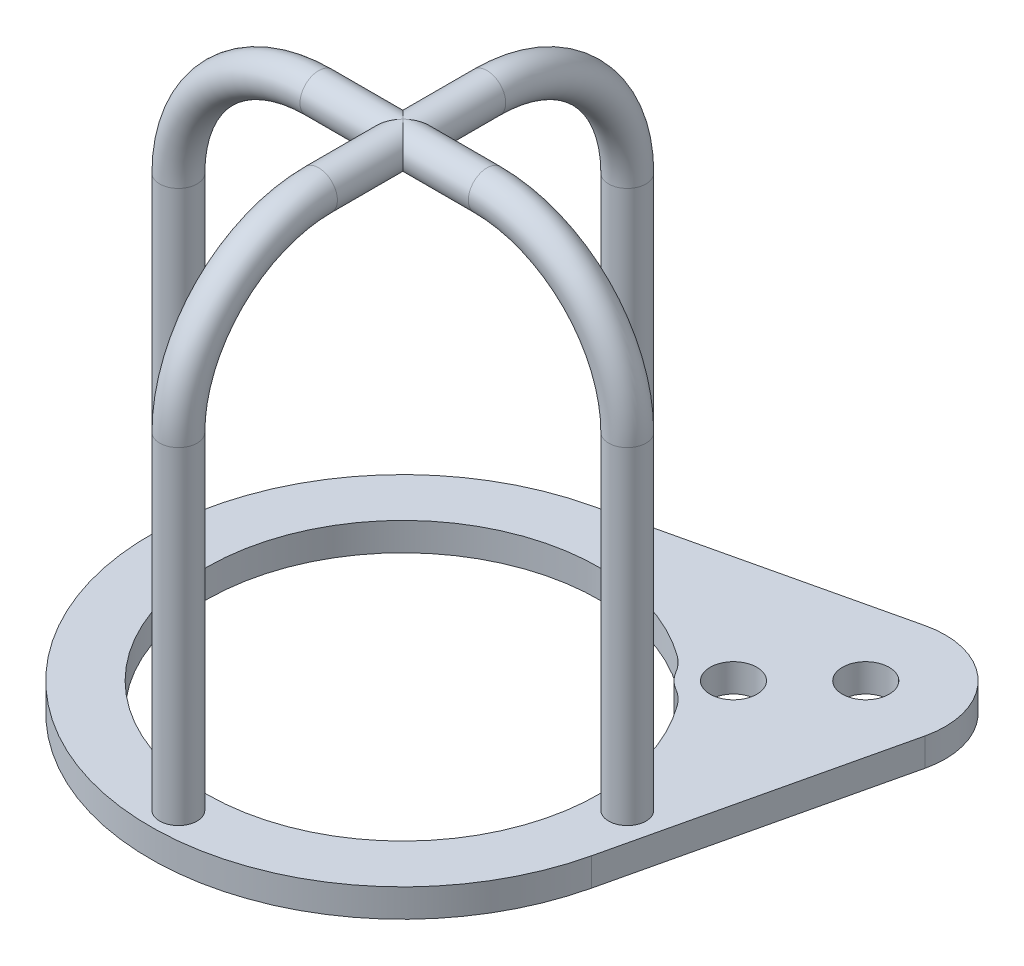
ISO-10303-21;
HEADER;
FILE_DESCRIPTION(('STEP AP214'),'2;1');
FILE_NAME('part.step','',(''),(''),'','','');
FILE_SCHEMA(('AUTOMOTIVE_DESIGN { 1 0 10303 214 1 1 1 1 }'));
ENDSEC;
DATA;
#1=APPLICATION_CONTEXT('core data for automotive mechanical design processes');
#2=APPLICATION_PROTOCOL_DEFINITION('international standard','automotive_design',2000,#1);
#3=PRODUCT_CONTEXT('',#1,'mechanical');
#4=PRODUCT('Part','Part','',(#3));
#5=PRODUCT_RELATED_PRODUCT_CATEGORY('part','',(#4));
#6=PRODUCT_DEFINITION_FORMATION('','',#4);
#7=PRODUCT_DEFINITION_CONTEXT('part definition',#1,'design');
#8=PRODUCT_DEFINITION('design','',#6,#7);
#9=PRODUCT_DEFINITION_SHAPE('','',#8);
#10=(LENGTH_UNIT() NAMED_UNIT(*) SI_UNIT(.MILLI.,.METRE.));
#11=(NAMED_UNIT(*) PLANE_ANGLE_UNIT() SI_UNIT($,.RADIAN.));
#12=(NAMED_UNIT(*) SI_UNIT($,.STERADIAN.) SOLID_ANGLE_UNIT());
#13=UNCERTAINTY_MEASURE_WITH_UNIT(LENGTH_MEASURE(1.E-05),#10,'distance_accuracy_value','');
#14=(GEOMETRIC_REPRESENTATION_CONTEXT(3) GLOBAL_UNCERTAINTY_ASSIGNED_CONTEXT((#13)) GLOBAL_UNIT_ASSIGNED_CONTEXT((#10,
#11,#12)) REPRESENTATION_CONTEXT('',''));
#15=CARTESIAN_POINT('',(0.,0.,0.));
#16=DIRECTION('',(0.,0.,1.));
#17=DIRECTION('',(1.,0.,0.));
#18=AXIS2_PLACEMENT_3D('',#15,#16,#17);
#19=CARTESIAN_POINT('',(0.,50.,0.));
#20=DIRECTION('',(1.,0.,0.));
#21=DIRECTION('',(0.,0.,-1.));
#22=AXIS2_PLACEMENT_3D('',#19,#20,#21);
#23=CYLINDRICAL_SURFACE('',#22,2.);
#24=CARTESIAN_POINT('',(-9.,50.,0.));
#25=DIRECTION('',(1.,0.,0.));
#26=DIRECTION('',(0.,0.,-1.));
#27=AXIS2_PLACEMENT_3D('',#24,#25,#26);
#28=CIRCLE('',#27,2.);
#29=CARTESIAN_POINT('',(-9.,52.,0.));
#30=VERTEX_POINT('',#29);
#31=EDGE_CURVE('E148',#30,#30,#28,.T.);
#32=ORIENTED_EDGE('',*,*,#31,.T.);
#33=EDGE_LOOP('',(#32));
#34=FACE_BOUND('',#33,.T.);
#35=CARTESIAN_POINT('',(0.,50.,0.));
#36=DIRECTION('',(0.707106781186551,0.,-0.707106781186544));
#37=DIRECTION('',(0.707106781186544,0.,0.707106781186551));
#38=AXIS2_PLACEMENT_3D('',#35,#36,#37);
#39=ELLIPSE('',#38,2.82842712474618,2.);
#40=CARTESIAN_POINT('',(0.,48.,0.));
#41=VERTEX_POINT('',#40);
#42=CARTESIAN_POINT('',(0.,52.,0.));
#43=VERTEX_POINT('',#42);
#44=EDGE_CURVE('E183',#41,#43,#39,.T.);
#45=ORIENTED_EDGE('',*,*,#44,.F.);
#46=CARTESIAN_POINT('',(0.,50.,0.));
#47=DIRECTION('',(0.707106781186546,0.,0.707106781186549));
#48=DIRECTION('',(-0.707106781186549,0.,0.707106781186546));
#49=AXIS2_PLACEMENT_3D('',#46,#47,#48);
#50=ELLIPSE('',#49,2.8284271247462,2.);
#51=EDGE_CURVE('E155',#41,#43,#50,.F.);
#52=ORIENTED_EDGE('',*,*,#51,.T.);
#53=EDGE_LOOP('',(#45,#52));
#54=FACE_BOUND('',#53,.T.);
#55=ADVANCED_FACE('F37',(#34,#54),#23,.T.);
#56=CARTESIAN_POINT('',(9.,50.,0.));
#57=DIRECTION('',(-1.,0.,0.));
#58=DIRECTION('',(0.,0.,1.));
#59=AXIS2_PLACEMENT_3D('',#56,#57,#58);
#60=CIRCLE('',#59,2.);
#61=CARTESIAN_POINT('',(9.,52.,0.));
#62=VERTEX_POINT('',#61);
#63=EDGE_CURVE('E167',#62,#62,#60,.T.);
#64=ORIENTED_EDGE('',*,*,#63,.T.);
#65=EDGE_LOOP('',(#64));
#66=FACE_BOUND('',#65,.T.);
#67=CARTESIAN_POINT('',(0.,50.,0.));
#68=DIRECTION('',(0.707106781186544,0.,0.707106781186551));
#69=DIRECTION('',(0.707106781186551,0.,-0.707106781186544));
#70=AXIS2_PLACEMENT_3D('',#67,#68,#69);
#71=ELLIPSE('',#70,2.82842712474621,2.);
#72=EDGE_CURVE('E180',#43,#41,#71,.F.);
#73=ORIENTED_EDGE('',*,*,#72,.F.);
#74=CARTESIAN_POINT('',(0.,50.,0.));
#75=DIRECTION('',(0.707106781186549,0.,-0.707106781186546));
#76=DIRECTION('',(0.707106781186546,0.,0.707106781186549));
#77=AXIS2_PLACEMENT_3D('',#74,#75,#76);
#78=ELLIPSE('',#77,2.82842712474619,2.);
#79=EDGE_CURVE('E175',#41,#43,#78,.F.);
#80=ORIENTED_EDGE('',*,*,#79,.F.);
#81=EDGE_LOOP('',(#73,#80));
#82=FACE_BOUND('',#81,.T.);
#83=ADVANCED_FACE('F262',(#66,#82),#23,.T.);
#84=CARTESIAN_POINT('',(0.,50.,0.));
#85=DIRECTION('',(0.,0.,1.));
#86=DIRECTION('',(1.,0.,0.));
#87=AXIS2_PLACEMENT_3D('',#84,#85,#86);
#88=CYLINDRICAL_SURFACE('',#87,2.);
#89=CARTESIAN_POINT('',(0.,50.,9.));
#90=DIRECTION('',(0.,0.,-1.));
#91=DIRECTION('',(-1.,0.,0.));
#92=AXIS2_PLACEMENT_3D('',#89,#90,#91);
#93=CIRCLE('',#92,2.);
#94=CARTESIAN_POINT('',(0.,52.,9.));
#95=VERTEX_POINT('',#94);
#96=EDGE_CURVE('E161',#95,#95,#93,.T.);
#97=ORIENTED_EDGE('',*,*,#96,.T.);
#98=EDGE_LOOP('',(#97));
#99=FACE_BOUND('',#98,.T.);
#100=ORIENTED_EDGE('',*,*,#51,.F.);
#101=ORIENTED_EDGE('',*,*,#79,.T.);
#102=EDGE_LOOP('',(#100,#101));
#103=FACE_BOUND('',#102,.T.);
#104=ADVANCED_FACE('F268',(#99,#103),#88,.T.);
#105=CARTESIAN_POINT('',(9.,35.,0.));
#106=DIRECTION('',(0.,0.,-1.));
#107=DIRECTION('',(-1.,0.,0.));
#108=AXIS2_PLACEMENT_3D('',#105,#106,#107);
#109=TOROIDAL_SURFACE('',#108,15.,2.);
#110=CARTESIAN_POINT('',(24.,35.,0.));
#111=DIRECTION('',(0.,1.,0.));
#112=DIRECTION('',(0.,0.,1.));
#113=AXIS2_PLACEMENT_3D('',#110,#111,#112);
#114=CIRCLE('',#113,2.);
#115=CARTESIAN_POINT('',(26.,35.,0.));
#116=VERTEX_POINT('',#115);
#117=EDGE_CURVE('E172',#116,#116,#114,.T.);
#118=CARTESIAN_POINT('',(9.,35.,0.));
#119=DIRECTION('',(0.,0.,-1.));
#120=DIRECTION('',(-1.,0.,0.));
#121=AXIS2_PLACEMENT_3D('',#118,#119,#120);
#122=CIRCLE('',#121,17.);
#123=EDGE_CURVE('',#62,#116,#122,.T.);
#124=ORIENTED_EDGE('',*,*,#63,.F.);
#125=ORIENTED_EDGE('',*,*,#117,.T.);
#126=ORIENTED_EDGE('',*,*,#123,.T.);
#127=ORIENTED_EDGE('',*,*,#123,.F.);
#128=EDGE_LOOP('',(#124,#126,#125,#127));
#129=FACE_BOUND('',#128,.T.);
#130=ADVANCED_FACE('F275',(#129),#109,.T.);
#131=CARTESIAN_POINT('',(24.,35.,0.));
#132=DIRECTION('',(0.,-1.,0.));
#133=DIRECTION('',(1.,0.,0.));
#134=AXIS2_PLACEMENT_3D('',#131,#132,#133);
#135=CYLINDRICAL_SURFACE('',#134,2.);
#136=CARTESIAN_POINT('',(24.,0.,0.));
#137=DIRECTION('',(0.,1.,0.));
#138=DIRECTION('',(0.,0.,1.));
#139=AXIS2_PLACEMENT_3D('',#136,#137,#138);
#140=CIRCLE('',#139,2.);
#141=CARTESIAN_POINT('',(24.,0.,2.));
#142=VERTEX_POINT('',#141);
#143=EDGE_CURVE('E146',#142,#142,#140,.T.);
#144=ORIENTED_EDGE('',*,*,#143,.T.);
#145=EDGE_LOOP('',(#144));
#146=FACE_BOUND('',#145,.T.);
#147=ORIENTED_EDGE('',*,*,#117,.F.);
#148=EDGE_LOOP('',(#147));
#149=FACE_BOUND('',#148,.T.);
#150=ADVANCED_FACE('F278',(#146,#149),#135,.T.);
#151=CARTESIAN_POINT('',(0.,35.,9.));
#152=DIRECTION('',(1.,0.,0.));
#153=DIRECTION('',(0.,0.,-1.));
#154=AXIS2_PLACEMENT_3D('',#151,#152,#153);
#155=TOROIDAL_SURFACE('',#154,15.,2.);
#156=CARTESIAN_POINT('',(0.,35.,24.));
#157=DIRECTION('',(0.,1.,0.));
#158=DIRECTION('',(-1.,0.,0.));
#159=AXIS2_PLACEMENT_3D('',#156,#157,#158);
#160=CIRCLE('',#159,2.);
#161=CARTESIAN_POINT('',(0.,35.,26.));
#162=VERTEX_POINT('',#161);
#163=EDGE_CURVE('E164',#162,#162,#160,.T.);
#164=CARTESIAN_POINT('',(0.,35.,9.));
#165=DIRECTION('',(1.,0.,0.));
#166=DIRECTION('',(0.,0.,-1.));
#167=AXIS2_PLACEMENT_3D('',#164,#165,#166);
#168=CIRCLE('',#167,17.);
#169=EDGE_CURVE('',#95,#162,#168,.T.);
#170=ORIENTED_EDGE('',*,*,#96,.F.);
#171=ORIENTED_EDGE('',*,*,#163,.T.);
#172=ORIENTED_EDGE('',*,*,#169,.T.);
#173=ORIENTED_EDGE('',*,*,#169,.F.);
#174=EDGE_LOOP('',(#170,#172,#171,#173));
#175=FACE_BOUND('',#174,.T.);
#176=ADVANCED_FACE('F281',(#175),#155,.T.);
#177=CARTESIAN_POINT('',(0.,35.,24.));
#178=DIRECTION('',(0.,-1.,0.));
#179=DIRECTION('',(0.,0.,-1.));
#180=AXIS2_PLACEMENT_3D('',#177,#178,#179);
#181=CYLINDRICAL_SURFACE('',#180,2.);
#182=CARTESIAN_POINT('',(0.,0.,24.));
#183=DIRECTION('',(0.,1.,0.));
#184=DIRECTION('',(-1.,0.,0.));
#185=AXIS2_PLACEMENT_3D('',#182,#183,#184);
#186=CIRCLE('',#185,2.);
#187=CARTESIAN_POINT('',(-2.00000000000009,0.,24.));
#188=VERTEX_POINT('',#187);
#189=EDGE_CURVE('E158',#188,#188,#186,.T.);
#190=ORIENTED_EDGE('',*,*,#189,.T.);
#191=EDGE_LOOP('',(#190));
#192=FACE_BOUND('',#191,.T.);
#193=ORIENTED_EDGE('',*,*,#163,.F.);
#194=EDGE_LOOP('',(#193));
#195=FACE_BOUND('',#194,.T.);
#196=ADVANCED_FACE('F273',(#192,#195),#181,.T.);
#197=CARTESIAN_POINT('',(-9.,35.,0.));
#198=DIRECTION('',(0.,0.,1.));
#199=DIRECTION('',(1.,0.,0.));
#200=AXIS2_PLACEMENT_3D('',#197,#198,#199);
#201=TOROIDAL_SURFACE('',#200,15.,2.);
#202=CARTESIAN_POINT('',(-24.,35.,0.));
#203=DIRECTION('',(0.,1.,0.));
#204=DIRECTION('',(0.,0.,-1.));
#205=AXIS2_PLACEMENT_3D('',#202,#203,#204);
#206=CIRCLE('',#205,2.);
#207=CARTESIAN_POINT('',(-26.,35.,0.));
#208=VERTEX_POINT('',#207);
#209=EDGE_CURVE('E152',#208,#208,#206,.T.);
#210=CARTESIAN_POINT('',(-9.,35.,0.));
#211=DIRECTION('',(0.,0.,1.));
#212=DIRECTION('',(1.,0.,0.));
#213=AXIS2_PLACEMENT_3D('',#210,#211,#212);
#214=CIRCLE('',#213,17.);
#215=EDGE_CURVE('',#30,#208,#214,.T.);
#216=ORIENTED_EDGE('',*,*,#31,.F.);
#217=ORIENTED_EDGE('',*,*,#209,.T.);
#218=ORIENTED_EDGE('',*,*,#215,.T.);
#219=ORIENTED_EDGE('',*,*,#215,.F.);
#220=EDGE_LOOP('',(#216,#218,#217,#219));
#221=FACE_BOUND('',#220,.T.);
#222=ADVANCED_FACE('F317',(#221),#201,.T.);
#223=CARTESIAN_POINT('',(-24.,35.,0.));
#224=DIRECTION('',(0.,-1.,0.));
#225=DIRECTION('',(1.,0.,0.));
#226=AXIS2_PLACEMENT_3D('',#223,#224,#225);
#227=CYLINDRICAL_SURFACE('',#226,2.);
#228=CARTESIAN_POINT('',(-24.,0.,0.));
#229=DIRECTION('',(0.,1.,0.));
#230=DIRECTION('',(0.,0.,-1.));
#231=AXIS2_PLACEMENT_3D('',#228,#229,#230);
#232=CIRCLE('',#231,2.);
#233=CARTESIAN_POINT('',(-24.,0.,-2.));
#234=VERTEX_POINT('',#233);
#235=EDGE_CURVE('E136',#234,#234,#232,.T.);
#236=ORIENTED_EDGE('',*,*,#235,.T.);
#237=EDGE_LOOP('',(#236));
#238=FACE_BOUND('',#237,.T.);
#239=ORIENTED_EDGE('',*,*,#209,.F.);
#240=EDGE_LOOP('',(#239));
#241=FACE_BOUND('',#240,.T.);
#242=ADVANCED_FACE('F314',(#238,#241),#227,.T.);
#243=CARTESIAN_POINT('',(0.,50.,0.));
#244=DIRECTION('',(0.,0.,-1.));
#245=DIRECTION('',(-1.,0.,0.));
#246=AXIS2_PLACEMENT_3D('',#243,#244,#245);
#247=CYLINDRICAL_SURFACE('',#246,2.);
#248=CARTESIAN_POINT('',(0.,50.,-9.));
#249=DIRECTION('',(0.,0.,1.));
#250=DIRECTION('',(1.,0.,0.));
#251=AXIS2_PLACEMENT_3D('',#248,#249,#250);
#252=CIRCLE('',#251,2.);
#253=CARTESIAN_POINT('',(0.,52.,-9.));
#254=VERTEX_POINT('',#253);
#255=EDGE_CURVE('E142',#254,#254,#252,.T.);
#256=ORIENTED_EDGE('',*,*,#255,.T.);
#257=EDGE_LOOP('',(#256));
#258=FACE_BOUND('',#257,.T.);
#259=ORIENTED_EDGE('',*,*,#72,.T.);
#260=ORIENTED_EDGE('',*,*,#44,.T.);
#261=EDGE_LOOP('',(#259,#260));
#262=FACE_BOUND('',#261,.T.);
#263=ADVANCED_FACE('F304',(#258,#262),#247,.T.);
#264=CARTESIAN_POINT('',(0.,35.,-9.));
#265=DIRECTION('',(-1.,0.,0.));
#266=DIRECTION('',(0.,0.,1.));
#267=AXIS2_PLACEMENT_3D('',#264,#265,#266);
#268=TOROIDAL_SURFACE('',#267,15.,2.);
#269=CARTESIAN_POINT('',(2.51386656396706E-13,35.,-24.));
#270=DIRECTION('',(0.,1.,0.));
#271=DIRECTION('',(1.,0.,0.));
#272=AXIS2_PLACEMENT_3D('',#269,#270,#271);
#273=CIRCLE('',#272,2.);
#274=CARTESIAN_POINT('',(2.72335544429764E-13,35.,-26.));
#275=VERTEX_POINT('',#274);
#276=EDGE_CURVE('E145',#275,#275,#273,.T.);
#277=CARTESIAN_POINT('',(0.,35.,-9.));
#278=DIRECTION('',(-1.,0.,0.));
#279=DIRECTION('',(0.,0.,1.));
#280=AXIS2_PLACEMENT_3D('',#277,#278,#279);
#281=CIRCLE('',#280,17.);
#282=EDGE_CURVE('',#254,#275,#281,.T.);
#283=ORIENTED_EDGE('',*,*,#255,.F.);
#284=ORIENTED_EDGE('',*,*,#276,.T.);
#285=ORIENTED_EDGE('',*,*,#282,.T.);
#286=ORIENTED_EDGE('',*,*,#282,.F.);
#287=EDGE_LOOP('',(#283,#285,#284,#286));
#288=FACE_BOUND('',#287,.T.);
#289=ADVANCED_FACE('F295',(#288),#268,.T.);
#290=CARTESIAN_POINT('',(2.51386656396706E-13,35.,-24.));
#291=DIRECTION('',(0.,-1.,0.));
#292=DIRECTION('',(0.,0.,-1.));
#293=AXIS2_PLACEMENT_3D('',#290,#291,#292);
#294=CYLINDRICAL_SURFACE('',#293,2.);
#295=CARTESIAN_POINT('',(2.51386656396706E-13,0.,-24.));
#296=DIRECTION('',(0.,1.,0.));
#297=DIRECTION('',(1.,0.,0.));
#298=AXIS2_PLACEMENT_3D('',#295,#296,#297);
#299=CIRCLE('',#298,2.);
#300=CARTESIAN_POINT('',(2.00000000000025,0.,-24.));
#301=VERTEX_POINT('',#300);
#302=EDGE_CURVE('E133',#301,#301,#299,.T.);
#303=ORIENTED_EDGE('',*,*,#302,.T.);
#304=EDGE_LOOP('',(#303));
#305=FACE_BOUND('',#304,.T.);
#306=ORIENTED_EDGE('',*,*,#276,.F.);
#307=EDGE_LOOP('',(#306));
#308=FACE_BOUND('',#307,.T.);
#309=ADVANCED_FACE('F292',(#305,#308),#294,.T.);
#310=CARTESIAN_POINT('',(24.7487373415292,-3.00000000000001,-24.7487373415291));
#311=DIRECTION('',(0.,1.,0.));
#312=DIRECTION('',(-1.,0.,0.));
#313=AXIS2_PLACEMENT_3D('',#310,#311,#312);
#314=PLANE('',#313);
#315=CARTESIAN_POINT('',(24.7487373415292,-3.00000000000001,-24.7487373415291));
#316=DIRECTION('',(0.,-1.,0.));
#317=DIRECTION('',(1.,0.,0.));
#318=AXIS2_PLACEMENT_3D('',#315,#316,#317);
#319=CIRCLE('',#318,2.5);
#320=CARTESIAN_POINT('',(27.2487373415292,-3.00000000000002,-24.7487373415291));
#321=VERTEX_POINT('',#320);
#322=EDGE_CURVE('E222',#321,#321,#319,.T.);
#323=ORIENTED_EDGE('',*,*,#322,.F.);
#324=EDGE_LOOP('',(#323));
#325=FACE_BOUND('',#324,.T.);
#326=CARTESIAN_POINT('',(17.6776695296637,-3.00000000000001,-17.6776695296637));
#327=DIRECTION('',(0.,-1.,0.));
#328=DIRECTION('',(1.,0.,0.));
#329=AXIS2_PLACEMENT_3D('',#326,#327,#328);
#330=CIRCLE('',#329,2.5);
#331=CARTESIAN_POINT('',(20.1776695296637,-3.00000000000001,-17.6776695296637));
#332=VERTEX_POINT('',#331);
#333=EDGE_CURVE('E228',#332,#332,#330,.T.);
#334=ORIENTED_EDGE('',*,*,#333,.F.);
#335=EDGE_LOOP('',(#334));
#336=FACE_BOUND('',#335,.T.);
#337=CARTESIAN_POINT('',(24.7487373415292,-3.00000000000001,-24.7487373415291));
#338=DIRECTION('',(0.,-1.,0.));
#339=DIRECTION('',(-1.,0.,0.));
#340=AXIS2_PLACEMENT_3D('',#337,#338,#339);
#341=CIRCLE('',#340,8.5);
#342=CARTESIAN_POINT('',(22.8234991875656,-3.00000000000001,-33.0278350007262));
#343=VERTEX_POINT('',#342);
#344=CARTESIAN_POINT('',(33.0278350007263,-3.00000000000002,-22.8234991875654));
#345=VERTEX_POINT('',#344);
#346=EDGE_CURVE('E119',#343,#345,#341,.T.);
#347=ORIENTED_EDGE('',*,*,#346,.T.);
#348=DIRECTION('',(-0.22649860634867,0.,0.974011489317303));
#349=VECTOR('',#348,1.);
#350=CARTESIAN_POINT('',(26.2983102115672,-3.00000000000002,6.11546237141407));
#351=LINE('',#350,#349);
#352=CARTESIAN_POINT('',(26.2983102115672,-3.00000000000002,6.11546237141407));
#353=VERTEX_POINT('',#352);
#354=EDGE_CURVE('E108',#345,#353,#351,.T.);
#355=ORIENTED_EDGE('',*,*,#354,.T.);
#356=CARTESIAN_POINT('',(0.,-3.,0.));
#357=DIRECTION('',(0.,-1.,0.));
#358=DIRECTION('',(1.,0.,0.));
#359=AXIS2_PLACEMENT_3D('',#356,#357,#358);
#360=CIRCLE('',#359,27.);
#361=CARTESIAN_POINT('',(-6.11546237141396,-3.,-26.2983102115672));
#362=VERTEX_POINT('',#361);
#363=EDGE_CURVE('E118',#353,#362,#360,.T.);
#364=ORIENTED_EDGE('',*,*,#363,.T.);
#365=DIRECTION('',(0.974011489317304,0.,-0.226498606348665));
#366=VECTOR('',#365,1.);
#367=CARTESIAN_POINT('',(22.8234991875656,-3.00000000000001,-33.0278350007262));
#368=LINE('',#367,#366);
#369=EDGE_CURVE('E124',#362,#343,#368,.T.);
#370=ORIENTED_EDGE('',*,*,#369,.T.);
#371=EDGE_LOOP('',(#347,#355,#364,#370));
#372=FACE_BOUND('',#371,.T.);
#373=CARTESIAN_POINT('',(0.,-3.,0.));
#374=DIRECTION('',(0.,-1.,0.));
#375=DIRECTION('',(1.,0.,0.));
#376=AXIS2_PLACEMENT_3D('',#373,#374,#375);
#377=CIRCLE('',#376,21.);
#378=CARTESIAN_POINT('',(16.9291216104544,-3.00000000000001,-12.4259744687669));
#379=VERTEX_POINT('',#378);
#380=CARTESIAN_POINT('',(12.425974468767,-3.00000000000001,-16.9291216104543));
#381=VERTEX_POINT('',#380);
#382=EDGE_CURVE('E212',#379,#381,#377,.T.);
#383=ORIENTED_EDGE('',*,*,#382,.F.);
#384=CARTESIAN_POINT('',(12.89837836987,-3.00000000000001,-9.46740911906049));
#385=DIRECTION('',(0.,1.,0.));
#386=DIRECTION('',(-1.,0.,0.));
#387=AXIS2_PLACEMENT_3D('',#384,#385,#386);
#388=CIRCLE('',#387,5.);
#389=CARTESIAN_POINT('',(15.4137947697614,-3.00000000000001,-13.7885988088516));
#390=VERTEX_POINT('',#389);
#391=EDGE_CURVE('E197',#379,#390,#388,.T.);
#392=ORIENTED_EDGE('',*,*,#391,.T.);
#393=CARTESIAN_POINT('',(17.6776695296637,-3.00000000000001,-17.6776695296637));
#394=DIRECTION('',(0.,1.,0.));
#395=DIRECTION('',(-1.,0.,0.));
#396=AXIS2_PLACEMENT_3D('',#393,#394,#395);
#397=CIRCLE('',#396,4.5);
#398=CARTESIAN_POINT('',(13.7885988088517,-3.00000000000001,-15.4137947697614));
#399=VERTEX_POINT('',#398);
#400=EDGE_CURVE('E216',#399,#390,#397,.T.);
#401=ORIENTED_EDGE('',*,*,#400,.F.);
#402=CARTESIAN_POINT('',(9.46740911906054,-3.00000000000001,-12.89837836987));
#403=DIRECTION('',(0.,1.,0.));
#404=DIRECTION('',(-1.,0.,0.));
#405=AXIS2_PLACEMENT_3D('',#402,#403,#404);
#406=CIRCLE('',#405,5.);
#407=EDGE_CURVE('E11',#399,#381,#406,.T.);
#408=ORIENTED_EDGE('',*,*,#407,.T.);
#409=EDGE_LOOP('',(#383,#392,#401,#408));
#410=FACE_BOUND('',#409,.T.);
#411=ADVANCED_FACE('F122',(#325,#336,#372,#410),#314,.F.);
#412=CARTESIAN_POINT('',(24.7487373415292,0.,-24.7487373415291));
#413=DIRECTION('',(0.,1.,0.));
#414=DIRECTION('',(-1.,0.,0.));
#415=AXIS2_PLACEMENT_3D('',#412,#413,#414);
#416=PLANE('',#415);
#417=ORIENTED_EDGE('',*,*,#143,.F.);
#418=EDGE_LOOP('',(#417));
#419=FACE_BOUND('',#418,.T.);
#420=ORIENTED_EDGE('',*,*,#189,.F.);
#421=EDGE_LOOP('',(#420));
#422=FACE_BOUND('',#421,.T.);
#423=ORIENTED_EDGE('',*,*,#235,.F.);
#424=EDGE_LOOP('',(#423));
#425=FACE_BOUND('',#424,.T.);
#426=ORIENTED_EDGE('',*,*,#302,.F.);
#427=EDGE_LOOP('',(#426));
#428=FACE_BOUND('',#427,.T.);
#429=CARTESIAN_POINT('',(17.6776695296637,0.,-17.6776695296637));
#430=DIRECTION('',(0.,-1.,0.));
#431=DIRECTION('',(1.,0.,0.));
#432=AXIS2_PLACEMENT_3D('',#429,#430,#431);
#433=CIRCLE('',#432,2.5);
#434=CARTESIAN_POINT('',(20.1776695296637,0.,-17.6776695296637));
#435=VERTEX_POINT('',#434);
#436=EDGE_CURVE('E225',#435,#435,#433,.T.);
#437=ORIENTED_EDGE('',*,*,#436,.T.);
#438=EDGE_LOOP('',(#437));
#439=FACE_BOUND('',#438,.T.);
#440=CARTESIAN_POINT('',(24.7487373415292,0.,-24.7487373415291));
#441=DIRECTION('',(0.,-1.,0.));
#442=DIRECTION('',(-1.,0.,0.));
#443=AXIS2_PLACEMENT_3D('',#440,#441,#442);
#444=CIRCLE('',#443,8.5);
#445=CARTESIAN_POINT('',(22.8234991875656,0.,-33.0278350007262));
#446=VERTEX_POINT('',#445);
#447=CARTESIAN_POINT('',(33.0278350007263,0.,-22.8234991875654));
#448=VERTEX_POINT('',#447);
#449=EDGE_CURVE('E132',#446,#448,#444,.T.);
#450=ORIENTED_EDGE('',*,*,#449,.F.);
#451=DIRECTION('',(0.974011489317304,0.,-0.226498606348665));
#452=VECTOR('',#451,1.);
#453=CARTESIAN_POINT('',(22.8234991875656,0.,-33.0278350007262));
#454=LINE('',#453,#452);
#455=CARTESIAN_POINT('',(-6.11546237141396,0.,-26.2983102115672));
#456=VERTEX_POINT('',#455);
#457=EDGE_CURVE('E128',#456,#446,#454,.T.);
#458=ORIENTED_EDGE('',*,*,#457,.F.);
#459=CARTESIAN_POINT('',(0.,0.,0.));
#460=DIRECTION('',(0.,-1.,0.));
#461=DIRECTION('',(1.,0.,0.));
#462=AXIS2_PLACEMENT_3D('',#459,#460,#461);
#463=CIRCLE('',#462,27.);
#464=CARTESIAN_POINT('',(26.2983102115672,0.,6.11546237141407));
#465=VERTEX_POINT('',#464);
#466=EDGE_CURVE('E239',#465,#456,#463,.T.);
#467=ORIENTED_EDGE('',*,*,#466,.F.);
#468=DIRECTION('',(-0.22649860634867,0.,0.974011489317303));
#469=VECTOR('',#468,1.);
#470=CARTESIAN_POINT('',(26.2983102115672,0.,6.11546237141407));
#471=LINE('',#470,#469);
#472=EDGE_CURVE('E237',#448,#465,#471,.T.);
#473=ORIENTED_EDGE('',*,*,#472,.F.);
#474=EDGE_LOOP('',(#450,#458,#467,#473));
#475=FACE_BOUND('',#474,.T.);
#476=CARTESIAN_POINT('',(24.7487373415292,0.,-24.7487373415291));
#477=DIRECTION('',(0.,-1.,0.));
#478=DIRECTION('',(1.,0.,0.));
#479=AXIS2_PLACEMENT_3D('',#476,#477,#478);
#480=CIRCLE('',#479,2.5);
#481=CARTESIAN_POINT('',(27.2487373415292,0.,-24.7487373415291));
#482=VERTEX_POINT('',#481);
#483=EDGE_CURVE('E218',#482,#482,#480,.T.);
#484=ORIENTED_EDGE('',*,*,#483,.T.);
#485=EDGE_LOOP('',(#484));
#486=FACE_BOUND('',#485,.T.);
#487=CARTESIAN_POINT('',(0.,0.,0.));
#488=DIRECTION('',(0.,-1.,0.));
#489=DIRECTION('',(1.,0.,0.));
#490=AXIS2_PLACEMENT_3D('',#487,#488,#489);
#491=CIRCLE('',#490,21.);
#492=CARTESIAN_POINT('',(16.9291216104544,0.,-12.4259744687669));
#493=VERTEX_POINT('',#492);
#494=CARTESIAN_POINT('',(12.425974468767,0.,-16.9291216104543));
#495=VERTEX_POINT('',#494);
#496=EDGE_CURVE('E204',#493,#495,#491,.T.);
#497=ORIENTED_EDGE('',*,*,#496,.T.);
#498=CARTESIAN_POINT('',(9.46740911906055,0.,-12.89837836987));
#499=DIRECTION('',(0.,1.,0.));
#500=DIRECTION('',(-1.,0.,0.));
#501=AXIS2_PLACEMENT_3D('',#498,#499,#500);
#502=CIRCLE('',#501,5.);
#503=CARTESIAN_POINT('',(13.7885988088517,0.,-15.4137947697614));
#504=VERTEX_POINT('',#503);
#505=EDGE_CURVE('E45',#495,#504,#502,.F.);
#506=ORIENTED_EDGE('',*,*,#505,.T.);
#507=CARTESIAN_POINT('',(17.6776695296637,0.,-17.6776695296637));
#508=DIRECTION('',(0.,1.,0.));
#509=DIRECTION('',(-1.,0.,0.));
#510=AXIS2_PLACEMENT_3D('',#507,#508,#509);
#511=CIRCLE('',#510,4.5);
#512=CARTESIAN_POINT('',(15.4137947697614,0.,-13.7885988088516));
#513=VERTEX_POINT('',#512);
#514=EDGE_CURVE('E203',#504,#513,#511,.T.);
#515=ORIENTED_EDGE('',*,*,#514,.T.);
#516=CARTESIAN_POINT('',(12.89837836987,0.,-9.46740911906049));
#517=DIRECTION('',(0.,1.,0.));
#518=DIRECTION('',(-1.,0.,0.));
#519=AXIS2_PLACEMENT_3D('',#516,#517,#518);
#520=CIRCLE('',#519,5.);
#521=EDGE_CURVE('E195',#513,#493,#520,.F.);
#522=ORIENTED_EDGE('',*,*,#521,.T.);
#523=EDGE_LOOP('',(#497,#506,#515,#522));
#524=FACE_BOUND('',#523,.T.);
#525=ADVANCED_FACE('F202',(#419,#422,#425,#428,#439,#475,#486,#524),#416,.T.);
#526=CARTESIAN_POINT('',(24.7487373415292,-3.00000000000001,-24.7487373415291));
#527=DIRECTION('',(0.,1.,0.));
#528=DIRECTION('',(-1.,0.,0.));
#529=AXIS2_PLACEMENT_3D('',#526,#527,#528);
#530=CYLINDRICAL_SURFACE('',#529,8.5);
#531=ORIENTED_EDGE('',*,*,#449,.T.);
#532=DIRECTION('',(0.,1.,0.));
#533=VECTOR('',#532,1.);
#534=CARTESIAN_POINT('',(33.0278350007263,-3.00000000000002,-22.8234991875654));
#535=LINE('',#534,#533);
#536=EDGE_CURVE('E112',#345,#448,#535,.T.);
#537=ORIENTED_EDGE('',*,*,#536,.F.);
#538=ORIENTED_EDGE('',*,*,#346,.F.);
#539=DIRECTION('',(0.,1.,0.));
#540=VECTOR('',#539,1.);
#541=CARTESIAN_POINT('',(22.8234991875656,-3.00000000000001,-33.0278350007262));
#542=LINE('',#541,#540);
#543=EDGE_CURVE('E235',#343,#446,#542,.T.);
#544=ORIENTED_EDGE('',*,*,#543,.T.);
#545=EDGE_LOOP('',(#531,#537,#538,#544));
#546=FACE_BOUND('',#545,.T.);
#547=ADVANCED_FACE('F130',(#546),#530,.T.);
#548=CARTESIAN_POINT('',(26.2983102115672,-3.00000000000002,6.11546237141407));
#549=DIRECTION('',(-0.974011489317303,0.,-0.22649860634867));
#550=DIRECTION('',(-0.22649860634867,0.,0.974011489317303));
#551=AXIS2_PLACEMENT_3D('',#548,#549,#550);
#552=PLANE('',#551);
#553=ORIENTED_EDGE('',*,*,#472,.T.);
#554=DIRECTION('',(0.,1.,0.));
#555=VECTOR('',#554,1.);
#556=CARTESIAN_POINT('',(26.2983102115672,-3.00000000000002,6.11546237141407));
#557=LINE('',#556,#555);
#558=EDGE_CURVE('E115',#353,#465,#557,.T.);
#559=ORIENTED_EDGE('',*,*,#558,.F.);
#560=ORIENTED_EDGE('',*,*,#354,.F.);
#561=ORIENTED_EDGE('',*,*,#536,.T.);
#562=EDGE_LOOP('',(#553,#559,#560,#561));
#563=FACE_BOUND('',#562,.T.);
#564=ADVANCED_FACE('F110',(#563),#552,.F.);
#565=CARTESIAN_POINT('',(0.,-3.,0.));
#566=DIRECTION('',(0.,1.,0.));
#567=DIRECTION('',(-1.,0.,0.));
#568=AXIS2_PLACEMENT_3D('',#565,#566,#567);
#569=CYLINDRICAL_SURFACE('',#568,27.);
#570=ORIENTED_EDGE('',*,*,#466,.T.);
#571=DIRECTION('',(0.,1.,0.));
#572=VECTOR('',#571,1.);
#573=CARTESIAN_POINT('',(-6.11546237141396,-3.,-26.2983102115672));
#574=LINE('',#573,#572);
#575=EDGE_CURVE('E138',#362,#456,#574,.T.);
#576=ORIENTED_EDGE('',*,*,#575,.F.);
#577=ORIENTED_EDGE('',*,*,#363,.F.);
#578=ORIENTED_EDGE('',*,*,#558,.T.);
#579=EDGE_LOOP('',(#570,#576,#577,#578));
#580=FACE_BOUND('',#579,.T.);
#581=ADVANCED_FACE('F251',(#580),#569,.T.);
#582=CARTESIAN_POINT('',(22.8234991875656,-3.00000000000001,-33.0278350007262));
#583=DIRECTION('',(0.226498606348665,0.,0.974011489317304));
#584=DIRECTION('',(0.974011489317304,0.,-0.226498606348665));
#585=AXIS2_PLACEMENT_3D('',#582,#583,#584);
#586=PLANE('',#585);
#587=ORIENTED_EDGE('',*,*,#457,.T.);
#588=ORIENTED_EDGE('',*,*,#543,.F.);
#589=ORIENTED_EDGE('',*,*,#369,.F.);
#590=ORIENTED_EDGE('',*,*,#575,.T.);
#591=EDGE_LOOP('',(#587,#588,#589,#590));
#592=FACE_BOUND('',#591,.T.);
#593=ADVANCED_FACE('F246',(#592),#586,.F.);
#594=CARTESIAN_POINT('',(17.6776695296637,-3.00000000000001,-17.6776695296637));
#595=DIRECTION('',(0.,1.,0.));
#596=DIRECTION('',(-1.,0.,0.));
#597=AXIS2_PLACEMENT_3D('',#594,#595,#596);
#598=CYLINDRICAL_SURFACE('',#597,2.5);
#599=ORIENTED_EDGE('',*,*,#333,.T.);
#600=EDGE_LOOP('',(#599));
#601=FACE_BOUND('',#600,.T.);
#602=ORIENTED_EDGE('',*,*,#436,.F.);
#603=EDGE_LOOP('',(#602));
#604=FACE_BOUND('',#603,.T.);
#605=ADVANCED_FACE('F258',(#601,#604),#598,.F.);
#606=CARTESIAN_POINT('',(24.7487373415292,-3.00000000000001,-24.7487373415291));
#607=DIRECTION('',(0.,1.,0.));
#608=DIRECTION('',(-1.,0.,0.));
#609=AXIS2_PLACEMENT_3D('',#606,#607,#608);
#610=CYLINDRICAL_SURFACE('',#609,2.5);
#611=ORIENTED_EDGE('',*,*,#322,.T.);
#612=EDGE_LOOP('',(#611));
#613=FACE_BOUND('',#612,.T.);
#614=ORIENTED_EDGE('',*,*,#483,.F.);
#615=EDGE_LOOP('',(#614));
#616=FACE_BOUND('',#615,.T.);
#617=ADVANCED_FACE('F356',(#613,#616),#610,.F.);
#618=CARTESIAN_POINT('',(0.,-3.,0.));
#619=DIRECTION('',(0.,1.,0.));
#620=DIRECTION('',(-1.,0.,0.));
#621=AXIS2_PLACEMENT_3D('',#618,#619,#620);
#622=CYLINDRICAL_SURFACE('',#621,21.);
#623=ORIENTED_EDGE('',*,*,#496,.F.);
#624=DIRECTION('',(0.,1.,0.));
#625=VECTOR('',#624,1.);
#626=CARTESIAN_POINT('',(16.9291216104544,-3.00000000000001,-12.4259744687669));
#627=LINE('',#626,#625);
#628=EDGE_CURVE('E57',#493,#379,#627,.F.);
#629=ORIENTED_EDGE('',*,*,#628,.T.);
#630=ORIENTED_EDGE('',*,*,#382,.T.);
#631=DIRECTION('',(0.,1.,0.));
#632=VECTOR('',#631,1.);
#633=CARTESIAN_POINT('',(12.425974468767,-3.00000000000001,-16.9291216104543));
#634=LINE('',#633,#632);
#635=EDGE_CURVE('E191',#381,#495,#634,.T.);
#636=ORIENTED_EDGE('',*,*,#635,.T.);
#637=EDGE_LOOP('',(#623,#629,#630,#636));
#638=FACE_BOUND('',#637,.T.);
#639=ADVANCED_FACE('F214',(#638),#622,.F.);
#640=CARTESIAN_POINT('',(17.6776695296637,-3.00000000000001,-17.6776695296637));
#641=DIRECTION('',(0.,1.,0.));
#642=DIRECTION('',(-1.,0.,0.));
#643=AXIS2_PLACEMENT_3D('',#640,#641,#642);
#644=CYLINDRICAL_SURFACE('',#643,4.5);
#645=ORIENTED_EDGE('',*,*,#400,.T.);
#646=DIRECTION('',(0.,1.,0.));
#647=VECTOR('',#646,1.);
#648=CARTESIAN_POINT('',(15.4137947697614,-3.00000000000001,-13.7885988088516));
#649=LINE('',#648,#647);
#650=EDGE_CURVE('E188',#390,#513,#649,.T.);
#651=ORIENTED_EDGE('',*,*,#650,.T.);
#652=ORIENTED_EDGE('',*,*,#514,.F.);
#653=DIRECTION('',(0.,1.,0.));
#654=VECTOR('',#653,1.);
#655=CARTESIAN_POINT('',(13.7885988088517,-3.00000000000001,-15.4137947697614));
#656=LINE('',#655,#654);
#657=EDGE_CURVE('E186',#504,#399,#656,.F.);
#658=ORIENTED_EDGE('',*,*,#657,.T.);
#659=EDGE_LOOP('',(#645,#651,#652,#658));
#660=FACE_BOUND('',#659,.T.);
#661=ADVANCED_FACE('F210',(#660),#644,.T.);
#662=CARTESIAN_POINT('',(12.89837836987,-3.00000000000001,-9.46740911906049));
#663=DIRECTION('',(0.,1.,0.));
#664=DIRECTION('',(-1.,0.,0.));
#665=AXIS2_PLACEMENT_3D('',#662,#663,#664);
#666=CYLINDRICAL_SURFACE('',#665,5.);
#667=ORIENTED_EDGE('',*,*,#391,.F.);
#668=ORIENTED_EDGE('',*,*,#628,.F.);
#669=ORIENTED_EDGE('',*,*,#521,.F.);
#670=ORIENTED_EDGE('',*,*,#650,.F.);
#671=EDGE_LOOP('',(#667,#668,#669,#670));
#672=FACE_BOUND('',#671,.T.);
#673=ADVANCED_FACE('F283',(#672),#666,.F.);
#674=CARTESIAN_POINT('',(9.46740911906054,-3.00000000000001,-12.89837836987));
#675=DIRECTION('',(0.,1.,0.));
#676=DIRECTION('',(-1.,0.,0.));
#677=AXIS2_PLACEMENT_3D('',#674,#675,#676);
#678=CYLINDRICAL_SURFACE('',#677,5.);
#679=ORIENTED_EDGE('',*,*,#407,.F.);
#680=ORIENTED_EDGE('',*,*,#657,.F.);
#681=ORIENTED_EDGE('',*,*,#505,.F.);
#682=ORIENTED_EDGE('',*,*,#635,.F.);
#683=EDGE_LOOP('',(#679,#680,#681,#682));
#684=FACE_BOUND('',#683,.T.);
#685=ADVANCED_FACE('F39',(#684),#678,.F.);
#686=CLOSED_SHELL('',(#55,#83,#104,#130,#150,#176,#196,#222,#242,#263,#289,#309,#411,#525,#547,
#564,#581,#593,#605,#617,#639,#661,#673,#685));
#687=MANIFOLD_SOLID_BREP('B2',#686);
#688=ADVANCED_BREP_SHAPE_REPRESENTATION('',(#18,#687),#14);
#689=SHAPE_DEFINITION_REPRESENTATION(#9,#688);
ENDSEC;
END-ISO-10303-21;
